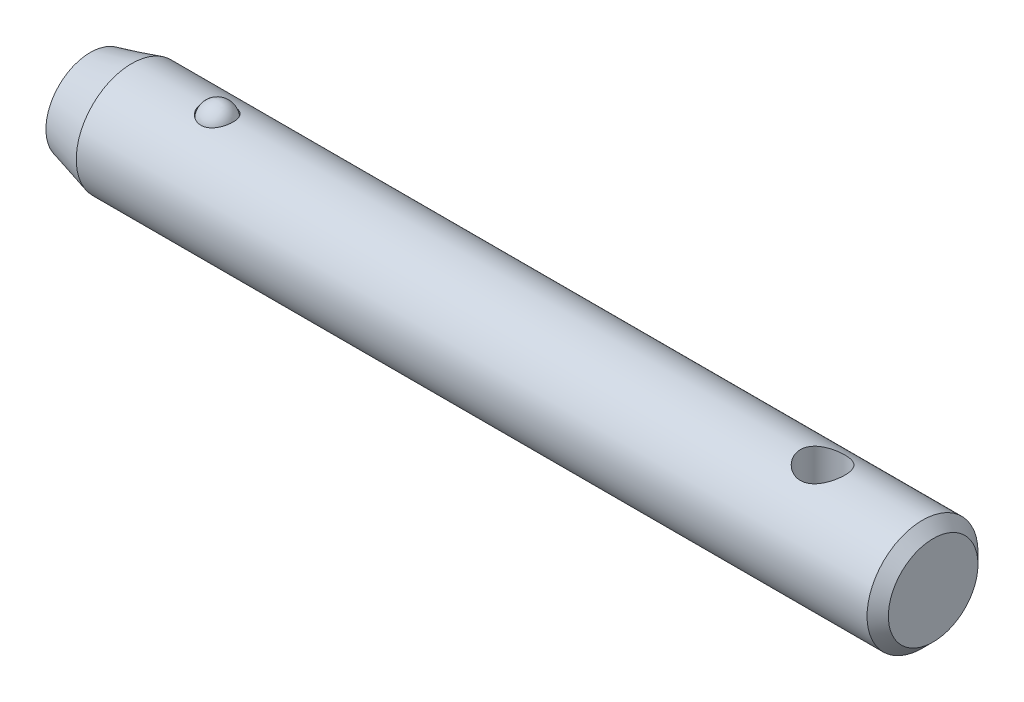
ISO-10303-21;
HEADER;
FILE_DESCRIPTION(('STEP AP214'),'2;1');
FILE_NAME('part.step','',(''),(''),'','','');
FILE_SCHEMA(('AUTOMOTIVE_DESIGN { 1 0 10303 214 1 1 1 1 }'));
ENDSEC;
DATA;
#1=APPLICATION_CONTEXT('core data for automotive mechanical design processes');
#2=APPLICATION_PROTOCOL_DEFINITION('international standard','automotive_design',2000,#1);
#3=PRODUCT_CONTEXT('',#1,'mechanical');
#4=PRODUCT('Part','Part','',(#3));
#5=PRODUCT_RELATED_PRODUCT_CATEGORY('part','',(#4));
#6=PRODUCT_DEFINITION_FORMATION('','',#4);
#7=PRODUCT_DEFINITION_CONTEXT('part definition',#1,'design');
#8=PRODUCT_DEFINITION('design','',#6,#7);
#9=PRODUCT_DEFINITION_SHAPE('','',#8);
#10=(LENGTH_UNIT() NAMED_UNIT(*) SI_UNIT(.MILLI.,.METRE.));
#11=(NAMED_UNIT(*) PLANE_ANGLE_UNIT() SI_UNIT($,.RADIAN.));
#12=(NAMED_UNIT(*) SI_UNIT($,.STERADIAN.) SOLID_ANGLE_UNIT());
#13=UNCERTAINTY_MEASURE_WITH_UNIT(LENGTH_MEASURE(1.E-05),#10,'distance_accuracy_value','');
#14=(GEOMETRIC_REPRESENTATION_CONTEXT(3) GLOBAL_UNCERTAINTY_ASSIGNED_CONTEXT((#13)) GLOBAL_UNIT_ASSIGNED_CONTEXT((#10,
#11,#12)) REPRESENTATION_CONTEXT('',''));
#15=CARTESIAN_POINT('',(0.,0.,0.));
#16=DIRECTION('',(0.,0.,1.));
#17=DIRECTION('',(1.,0.,0.));
#18=AXIS2_PLACEMENT_3D('',#15,#16,#17);
#19=CARTESIAN_POINT('',(-10.5325354166626,1.7859375,0.));
#20=DIRECTION('',(-1.,0.,0.));
#21=DIRECTION('',(0.,1.,0.));
#22=AXIS2_PLACEMENT_3D('',#19,#20,#21);
#23=SPHERICAL_SURFACE('',#22,0.5730875);
#24=CARTESIAN_POINT('',(-11.1056229166626,1.7859375,0.));
#25=VERTEX_POINT('',#24);
#26=VERTEX_LOOP('',#25);
#27=FACE_BOUND('',#26,.T.);
#28=ADVANCED_FACE('F43',(#27),#23,.T.);
#29=CLOSED_SHELL('',(#28));
#30=MANIFOLD_SOLID_BREP('B2',#29);
#31=CARTESIAN_POINT('',(39.8114454860181,0.,0.));
#32=DIRECTION('',(1.,0.,0.));
#33=DIRECTION('',(0.,0.,-1.));
#34=AXIS2_PLACEMENT_3D('',#31,#32,#33);
#35=CYLINDRICAL_SURFACE('',#34,1.984375);
#36=CARTESIAN_POINT('',(11.9126,1.984375,0.));
#37=CARTESIAN_POINT('',(11.9125960900575,1.98437210768249,-0.0426612865351476));
#38=CARTESIAN_POINT('',(11.9091401421399,1.98298313678064,-0.0853966113734861));
#39=CARTESIAN_POINT('',(11.895436067665,1.97756245449317,-0.169662665665853));
#40=CARTESIAN_POINT('',(11.8851694767377,1.97352355921117,-0.211189799219621));
#41=CARTESIAN_POINT('',(11.8582773065204,1.96323826781456,-0.291684838082439));
#42=CARTESIAN_POINT('',(11.8416725454077,1.95699910369491,-0.330660637579232));
#43=CARTESIAN_POINT('',(11.802658015586,1.94292779909693,-0.405237938224073));
#44=CARTESIAN_POINT('',(11.7802502619541,1.93509621178666,-0.440840604835552));
#45=CARTESIAN_POINT('',(11.7291502865086,1.91821945448885,-0.509389462379502));
#46=CARTESIAN_POINT('',(11.7002295458046,1.90913661593772,-0.542155964418368));
#47=CARTESIAN_POINT('',(11.6374068736202,1.89095291459646,-0.602525705023939));
#48=CARTESIAN_POINT('',(11.6035025195441,1.88185204517599,-0.630126417518624));
#49=CARTESIAN_POINT('',(11.5298426096226,1.86421232994488,-0.680590843894364));
#50=CARTESIAN_POINT('',(11.4898938008595,1.8557165227359,-0.703189070661956));
#51=CARTESIAN_POINT('',(11.406371491877,1.84083978727258,-0.741265154117871));
#52=CARTESIAN_POINT('',(11.3627997248852,1.83445785493782,-0.756746392700943));
#53=CARTESIAN_POINT('',(11.2753329176056,1.82493585696637,-0.779422345535237));
#54=CARTESIAN_POINT('',(11.2315421658807,1.82166188703631,-0.786961042679119));
#55=CARTESIAN_POINT('',(11.1432042350468,1.81833839107004,-0.794612394150889));
#56=CARTESIAN_POINT('',(11.0986574386957,1.81828727941849,-0.794728700224313));
#57=CARTESIAN_POINT('',(11.0133778210151,1.82130104798623,-0.787792655228369));
#58=CARTESIAN_POINT('',(10.9725953258439,1.82414931968385,-0.781238640364854));
#59=CARTESIAN_POINT('',(10.8927663637098,1.8322773695686,-0.7619789181182));
#60=CARTESIAN_POINT('',(10.8537202009687,1.83755757202664,-0.749272137313091));
#61=CARTESIAN_POINT('',(10.7775304212597,1.8500704564451,-0.717825721981209));
#62=CARTESIAN_POINT('',(10.7404418957502,1.85734078652063,-0.698968257856394));
#63=CARTESIAN_POINT('',(10.6698193478815,1.87300439942237,-0.6558385016031));
#64=CARTESIAN_POINT('',(10.6362866675183,1.88139810353187,-0.6315641757744));
#65=CARTESIAN_POINT('',(10.5709998888817,1.89915298644589,-0.576084144158481));
#66=CARTESIAN_POINT('',(10.5395836605011,1.9085387953741,-0.544487680616473));
#67=CARTESIAN_POINT('',(10.4823877227929,1.92666868030318,-0.47637478838636));
#68=CARTESIAN_POINT('',(10.4566091360278,1.93541262826738,-0.439857382179605));
#69=CARTESIAN_POINT('',(10.4109768255568,1.95149264126868,-0.361980818377945));
#70=CARTESIAN_POINT('',(10.3912502196499,1.95879747819118,-0.320540257503135));
#71=CARTESIAN_POINT('',(10.3591646301346,1.97094009992976,-0.23456255692602));
#72=CARTESIAN_POINT('',(10.3468019038444,1.97577913780383,-0.190027003124715));
#73=CARTESIAN_POINT('',(10.3304783327553,1.98221655366805,-0.101955555394354));
#74=CARTESIAN_POINT('',(10.3260634322181,1.98398981627676,-0.0585165573005095));
#75=CARTESIAN_POINT('',(10.3244201132277,1.98464677408907,0.0285136073299771));
#76=CARTESIAN_POINT('',(10.3271898320108,1.98353121827972,0.0721047314982445));
#77=CARTESIAN_POINT('',(10.3395032892941,1.97865034428427,0.156143618339039));
#78=CARTESIAN_POINT('',(10.3487370734518,1.97500633440255,0.196644613923392));
#79=CARTESIAN_POINT('',(10.3732947967355,1.96556090807808,0.275484998011623));
#80=CARTESIAN_POINT('',(10.388619518181,1.95975921450873,0.313824108120486));
#81=CARTESIAN_POINT('',(10.4254240229355,1.94634086049666,0.388571893121005));
#82=CARTESIAN_POINT('',(10.4470777342171,1.93867411341984,0.424885652781053));
#83=CARTESIAN_POINT('',(10.4957325660501,1.9223567913338,0.493491675275978));
#84=CARTESIAN_POINT('',(10.5227358295349,1.91370582265639,0.525782318052074));
#85=CARTESIAN_POINT('',(10.5834140363894,1.89565406062626,0.587661957702064));
#86=CARTESIAN_POINT('',(10.6174117492853,1.88624147065567,0.616931842479283));
#87=CARTESIAN_POINT('',(10.6900027829443,1.86825601438987,0.669429381473568));
#88=CARTESIAN_POINT('',(10.7285968595099,1.85968328662084,0.692656039968325));
#89=CARTESIAN_POINT('',(10.809867610042,1.84433487775872,0.732554852329117));
#90=CARTESIAN_POINT('',(10.8525802121874,1.837577410074,0.749161329705863));
#91=CARTESIAN_POINT('',(10.9405474180245,1.82690957911554,0.774817562195545));
#92=CARTESIAN_POINT('',(10.9858001191818,1.82299711479349,0.783872894591262));
#93=CARTESIAN_POINT('',(11.0740538860168,1.81876604472158,0.793637135607368));
#94=CARTESIAN_POINT('',(11.1169826394636,1.81820907712618,0.794899779538953));
#95=CARTESIAN_POINT('',(11.202409990405,1.82012763050636,0.79049687883827));
#96=CARTESIAN_POINT('',(11.2449086418301,1.82260276641402,0.784832213953285));
#97=CARTESIAN_POINT('',(11.3265474628487,1.83009638853236,0.767187698442232));
#98=CARTESIAN_POINT('',(11.3657539839156,1.83501042631519,0.755466442760985));
#99=CARTESIAN_POINT('',(11.4416596436279,1.84675462989226,0.726283412369874));
#100=CARTESIAN_POINT('',(11.4783580864259,1.85358532478634,0.708820052303173));
#101=CARTESIAN_POINT('',(11.5504950676481,1.86887885686782,0.667493252720271));
#102=CARTESIAN_POINT('',(11.585741159708,1.87741275168068,0.643320617391425));
#103=CARTESIAN_POINT('',(11.6518504727652,1.89493447360232,0.589713434835878));
#104=CARTESIAN_POINT('',(11.6827123676884,1.90392243694211,0.560277301630945));
#105=CARTESIAN_POINT('',(11.741230507389,1.92204009437809,0.494706872801886));
#106=CARTESIAN_POINT('',(11.7685491811752,1.93114119566242,0.458262037954876));
#107=CARTESIAN_POINT('',(11.8166900137905,1.94786411414506,0.380960439613421));
#108=CARTESIAN_POINT('',(11.8375091513855,1.95548524277497,0.340101636179687));
#109=CARTESIAN_POINT('',(11.8715719416537,1.96826074317545,0.255880418552786));
#110=CARTESIAN_POINT('',(11.884949450288,1.97345840962464,0.212578798480944));
#111=CARTESIAN_POINT('',(11.9041224011287,1.98097896526842,0.124172879305361));
#112=CARTESIAN_POINT('',(11.9099419045827,1.98331097612331,0.0790747743252574));
#113=CARTESIAN_POINT('',(11.9123600418258,1.98427935115704,0.0225870682254636));
#114=CARTESIAN_POINT('',(11.9126010352997,1.98437576584642,0.0112961295939889));
#115=CARTESIAN_POINT('',(11.9126,1.984375,0.));
#116=B_SPLINE_CURVE_WITH_KNOTS('',3,(#36,#37,#38,#39,#40,#41,#42,#43,#44,#45,#46,#47,#48,#49,
#50,#51,#52,#53,#54,#55,#56,#57,#58,#59,#60,#61,#62,#63,#64,#65,#66,#67,#68,#69,#70,#71,#72,#73,
#74,#75,#76,#77,#78,#79,#80,#81,#82,#83,#84,#85,#86,#87,#88,#89,#90,#91,#92,#93,#94,#95,#96,#97,
#98,#99,#100,#101,#102,#103,#104,#105,#106,#107,#108,#109,#110,#111,#112,#113,#114,#115),
.UNSPECIFIED.,.T.,.F.,(4,2,2,2,2,2,2,2,2,2,2,2,2,2,2,2,2,2,2,2,2,2,2,2,2,2,2,2,2,2,2,2,2,2,2,2,
2,2,2,4),(0.,0.127953685820063,0.25625569304065,0.384139859684036,0.511979678222939,
0.645308358623454,0.778702067395949,0.918032433438772,1.05729652300063,1.19024441794441,
1.32312690328882,1.44676149084295,1.57041765567244,1.69659746999843,1.82282473706717,
1.95880969833415,2.0948217122077,2.23352087411489,2.37214948207661,2.50257145109554,
2.63295960885627,2.75748930802108,2.88203500694414,3.01039019379936,3.13879690176154,
3.27568113366565,3.41258790526738,3.55082096040267,3.68895182581356,3.81714245377748,
3.9453168036096,4.06842245174044,4.19156211710175,4.32175232635001,4.45198183035145,
4.59065480589993,4.72939214632338,4.86554581964662,5.00126497047975,5.03514536965292),.UNSPECIFIED.);
#117=CARTESIAN_POINT('',(11.9126,1.984375,0.));
#118=VERTEX_POINT('',#117);
#119=EDGE_CURVE('E45',#118,#118,#116,.T.);
#120=ORIENTED_EDGE('',*,*,#119,.F.);
#121=EDGE_LOOP('',(#120));
#122=FACE_BOUND('',#121,.T.);
#123=CARTESIAN_POINT('',(11.11885,-1.8187097289356,-0.793750000000003));
#124=CARTESIAN_POINT('',(11.1613709883084,-1.81871402376142,-0.793745338387131));
#125=CARTESIAN_POINT('',(11.2039521184609,-1.82022195360943,-0.790312990504637));
#126=CARTESIAN_POINT('',(11.2878928867981,-1.82606519068301,-0.776711771516493));
#127=CARTESIAN_POINT('',(11.3292491208413,-1.83040772231657,-0.766525686450473));
#128=CARTESIAN_POINT('',(11.4093835113444,-1.84134305892171,-0.739868278550707));
#129=CARTESIAN_POINT('',(11.4481707422336,-1.8479273761673,-0.723420635533531));
#130=CARTESIAN_POINT('',(11.5224262545599,-1.86259257709689,-0.684776169406861));
#131=CARTESIAN_POINT('',(11.5578952583818,-1.87067313389994,-0.662580601615541));
#132=CARTESIAN_POINT('',(11.6265564721396,-1.88793780817129,-0.611712158664385));
#133=CARTESIAN_POINT('',(11.6595352053501,-1.89715742439877,-0.582763057598036));
#134=CARTESIAN_POINT('',(11.7203255708095,-1.91536818863465,-0.519790801354076));
#135=CARTESIAN_POINT('',(11.7481353973869,-1.92435925585998,-0.485765880477538));
#136=CARTESIAN_POINT('',(11.7988581638025,-1.94152602513033,-0.411958754422689));
#137=CARTESIAN_POINT('',(11.8215347696462,-1.94965559586916,-0.372002433227376));
#138=CARTESIAN_POINT('',(11.8597535412047,-1.9637530877877,-0.288458800016064));
#139=CARTESIAN_POINT('',(11.8752986100447,-1.96972188837042,-0.244872974061161));
#140=CARTESIAN_POINT('',(11.8980511524298,-1.97857397737663,-0.157546050651686));
#141=CARTESIAN_POINT('',(11.9056258402791,-1.9815926553272,-0.113914628344329));
#142=CARTESIAN_POINT('',(11.9134050552474,-1.98469373302198,-0.0259025741780686));
#143=CARTESIAN_POINT('',(11.9136123312616,-1.98477722792821,0.0184777720619562));
#144=CARTESIAN_POINT('',(11.9068521507456,-1.98208091494896,0.104073521340139));
#145=CARTESIAN_POINT('',(11.9002870433161,-1.97946167468822,0.145326676609382));
#146=CARTESIAN_POINT('',(11.8808528272142,-1.97187062551676,0.226089015221028));
#147=CARTESIAN_POINT('',(11.8679832559848,-1.96689864398691,0.265598070367345));
#148=CARTESIAN_POINT('',(11.8361473958585,-1.9549936470665,0.342462619346814));
#149=CARTESIAN_POINT('',(11.8170921444326,-1.94803220560261,0.379776681778793));
#150=CARTESIAN_POINT('',(11.773509200379,-1.93283913493192,0.450773859825167));
#151=CARTESIAN_POINT('',(11.7489796321144,-1.92460707067701,0.484455725077957));
#152=CARTESIAN_POINT('',(11.6932673741712,-1.90707024755151,0.549580128609386));
#153=CARTESIAN_POINT('',(11.6617536113808,-1.8977305458772,0.580730457342977));
#154=CARTESIAN_POINT('',(11.5939131168086,-1.87944784195397,0.637423880481052));
#155=CARTESIAN_POINT('',(11.5575848158888,-1.87050497031238,0.662965139554616));
#156=CARTESIAN_POINT('',(11.4798399504815,-1.85379081172219,0.708383849907354));
#157=CARTESIAN_POINT('',(11.4383086454017,-1.84605975315735,0.728080939907293));
#158=CARTESIAN_POINT('',(11.3521269772229,-1.83311637466719,0.760085578174115));
#159=CARTESIAN_POINT('',(11.3074786610441,-1.82790241925825,0.772397925929249));
#160=CARTESIAN_POINT('',(11.2192451758301,-1.82098060870049,0.788572745317686));
#161=CARTESIAN_POINT('',(11.1757616975492,-1.8190780168408,0.79290548842084));
#162=CARTESIAN_POINT('',(11.0886568581671,-1.81843956969973,0.794369651434457));
#163=CARTESIAN_POINT('',(11.0450355428866,-1.81970275410727,0.791503255141553));
#164=CARTESIAN_POINT('',(10.9615053601898,-1.82505367604237,0.779078680119198));
#165=CARTESIAN_POINT('',(10.9215265529696,-1.8289764418849,0.769910933990562));
#166=CARTESIAN_POINT('',(10.8437011643506,-1.83899989001686,0.745650411680416));
#167=CARTESIAN_POINT('',(10.8058550578605,-1.8451010551897,0.730556321738765));
#168=CARTESIAN_POINT('',(10.7316578142499,-1.85909657175668,0.694188206919205));
#169=CARTESIAN_POINT('',(10.6954295438619,-1.86705360903657,0.672688388342513));
#170=CARTESIAN_POINT('',(10.6269301893591,-1.88376871609517,0.624349948450371));
#171=CARTESIAN_POINT('',(10.5946607254842,-1.89252711130625,0.597509152913164));
#172=CARTESIAN_POINT('',(10.5325174284622,-1.91063926026148,0.536910046510694));
#173=CARTESIAN_POINT('',(10.5029966131501,-1.91998920391315,0.502787217311025));
#174=CARTESIAN_POINT('',(10.4500453477203,-1.93762230969001,0.429848816993262));
#175=CARTESIAN_POINT('',(10.4266151455067,-1.94590542838567,0.391033054954435));
#176=CARTESIAN_POINT('',(10.3865967232482,-1.96049787247926,0.30967359880695));
#177=CARTESIAN_POINT('',(10.3700068649717,-1.96680767039109,0.267130800269521));
#178=CARTESIAN_POINT('',(10.3443290492007,-1.97672608158125,0.179543706396068));
#179=CARTESIAN_POINT('',(10.335237020366,-1.98033616071431,0.134500782835539));
#180=CARTESIAN_POINT('',(10.3252965715424,-1.98429168883547,0.0463615525436894));
#181=CARTESIAN_POINT('',(10.3239490115164,-1.98483476676871,0.00332997674786914));
#182=CARTESIAN_POINT('',(10.3282176433409,-1.98312898069004,-0.0823253035566308));
#183=CARTESIAN_POINT('',(10.3338327810587,-1.98088053930618,-0.124949068822241));
#184=CARTESIAN_POINT('',(10.3515107566298,-1.97394319366439,-0.207236576709982));
#185=CARTESIAN_POINT('',(10.3633702379737,-1.9693313762675,-0.246951025594828));
#186=CARTESIAN_POINT('',(10.3929865818105,-1.9581611992084,-0.323819184544955));
#187=CARTESIAN_POINT('',(10.4107445320143,-1.9516024805503,-0.360972420781076));
#188=CARTESIAN_POINT('',(10.4525378319005,-1.93682181199148,-0.433468082236646));
#189=CARTESIAN_POINT('',(10.4768159045325,-1.92853917110891,-0.4686579347638));
#190=CARTESIAN_POINT('',(10.5305973185491,-1.91130794389621,-0.534612067570492));
#191=CARTESIAN_POINT('',(10.5601028226576,-1.90235908282542,-0.565374506530348));
#192=CARTESIAN_POINT('',(10.6256594797334,-1.88411549912646,-0.623570502081004));
#193=CARTESIAN_POINT('',(10.6620027716311,-1.87483366065262,-0.650680089607116));
#194=CARTESIAN_POINT('',(10.739017660792,-1.85757213366712,-0.698439456893138));
#195=CARTESIAN_POINT('',(10.7796897661861,-1.84959259830334,-0.71908847716656));
#196=CARTESIAN_POINT('',(10.8604991394835,-1.83657424331732,-0.751677712920347));
#197=CARTESIAN_POINT('',(10.9003565150419,-1.83133570823998,-0.764233419683922));
#198=CARTESIAN_POINT('',(10.9817239009158,-1.82342632680323,-0.782922360134174));
#199=CARTESIAN_POINT('',(11.0232289678994,-1.82074832728644,-0.789073490068058));
#200=CARTESIAN_POINT('',(11.0828842200529,-1.81897519569436,-0.793140502516853));
#201=CARTESIAN_POINT('',(11.1008617283334,-1.81870791203301,-0.793751972069846));
#202=CARTESIAN_POINT('',(11.11885,-1.8187097289356,-0.793750000000003));
#203=B_SPLINE_CURVE_WITH_KNOTS('',3,(#123,#124,#125,#126,#127,#128,#129,#130,#131,#132,#133,
#134,#135,#136,#137,#138,#139,#140,#141,#142,#143,#144,#145,#146,#147,#148,#149,#150,#151,#152,
#153,#154,#155,#156,#157,#158,#159,#160,#161,#162,#163,#164,#165,#166,#167,#168,#169,#170,#171,
#172,#173,#174,#175,#176,#177,#178,#179,#180,#181,#182,#183,#184,#185,#186,#187,#188,#189,#190,
#191,#192,#193,#194,#195,#196,#197,#198,#199,#200,#201,#202),.UNSPECIFIED.,.T.,.F.,(4,2,2,2,2,2,
2,2,2,2,2,2,2,2,2,2,2,2,2,2,2,2,2,2,2,2,2,2,2,2,2,2,2,2,2,2,2,2,2,4),(0.,0.127507066854663,
0.255340380154454,0.382694982994566,0.510021795644701,0.643951985066312,0.777928873194986,
0.917188717956609,1.05639182203513,1.18885566333351,1.32127007980689,1.44624680917027,
1.57123270941846,1.69810231655726,1.82501545929325,1.96026104994789,2.09555082828579,
2.23466207052348,2.37368280340164,2.50421039796378,2.63469840289212,2.75775439081415,
2.88083767337492,3.00891239500414,3.1370393607507,3.27463044526894,3.41222712923558,
3.54979084024896,3.68727980454422,3.81579850150768,3.94429774347938,4.06884979042329,
4.19342481823344,4.32350485918782,4.45363884384043,4.59182888020352,4.73003515570802,
4.85583174760195,4.98127587615887,5.03521704378543),.UNSPECIFIED.);
#204=CARTESIAN_POINT('',(11.11885,-1.8187097289356,-0.793750000000003));
#205=VERTEX_POINT('',#204);
#206=EDGE_CURVE('E62',#205,#205,#203,.T.);
#207=ORIENTED_EDGE('',*,*,#206,.F.);
#208=EDGE_LOOP('',(#207));
#209=FACE_BOUND('',#208,.T.);
#210=CARTESIAN_POINT('',(14.6939,0.,0.));
#211=DIRECTION('',(1.,0.,0.));
#212=DIRECTION('',(0.,0.,-1.));
#213=AXIS2_PLACEMENT_3D('',#210,#211,#212);
#214=CIRCLE('',#213,1.984375);
#215=CARTESIAN_POINT('',(14.6939,0.,-1.984375));
#216=VERTEX_POINT('',#215);
#217=EDGE_CURVE('E118',#216,#216,#214,.T.);
#218=ORIENTED_EDGE('',*,*,#217,.F.);
#219=EDGE_LOOP('',(#218));
#220=FACE_BOUND('',#219,.T.);
#221=CARTESIAN_POINT('',(-13.5937423357461,0.,0.));
#222=DIRECTION('',(1.,0.,0.));
#223=DIRECTION('',(0.,0.,-1.));
#224=AXIS2_PLACEMENT_3D('',#221,#222,#223);
#225=CIRCLE('',#224,1.984375);
#226=CARTESIAN_POINT('',(-13.5937423357461,0.,-1.984375));
#227=VERTEX_POINT('',#226);
#228=EDGE_CURVE('E69',#227,#227,#225,.T.);
#229=ORIENTED_EDGE('',*,*,#228,.T.);
#230=EDGE_LOOP('',(#229));
#231=FACE_BOUND('',#230,.T.);
#232=CARTESIAN_POINT('',(-10.5325354166626,1.8951194,0.588444220275184));
#233=CARTESIAN_POINT('',(-10.5629546226428,1.89511966951429,0.588443919644855));
#234=CARTESIAN_POINT('',(-10.593377414144,1.89590452620942,0.585933450579152));
#235=CARTESIAN_POINT('',(-10.6533311077073,1.89895261139773,0.575976987985483));
#236=CARTESIAN_POINT('',(-10.6828617619571,1.90121624677769,0.568529636063152));
#237=CARTESIAN_POINT('',(-10.7401515588187,1.90695750688567,0.548962747515325));
#238=CARTESIAN_POINT('',(-10.7679132728371,1.91043331961825,0.536850181771699));
#239=CARTESIAN_POINT('',(-10.821001376245,1.91821840684766,0.508330434458828));
#240=CARTESIAN_POINT('',(-10.8463275681322,1.92252774885215,0.491922905001787));
#241=CARTESIAN_POINT('',(-10.894550843812,1.93164322822779,0.454830920602075));
#242=CARTESIAN_POINT('',(-10.9173723669971,1.93645901586786,0.434050731737875));
#243=CARTESIAN_POINT('',(-10.9593533731564,1.94599797314362,0.389055756583387));
#244=CARTESIAN_POINT('',(-10.9785121599335,1.95072112501871,0.364840318856511));
#245=CARTESIAN_POINT('',(-11.0135792697045,1.9598139451965,0.31242871278134));
#246=CARTESIAN_POINT('',(-11.0292974712369,1.96415734961258,0.284100649667973));
#247=CARTESIAN_POINT('',(-11.0559978062927,1.97178334589193,0.225160976637039));
#248=CARTESIAN_POINT('',(-11.0669792145804,1.97506577529333,0.194549017880288));
#249=CARTESIAN_POINT('',(-11.0842121429827,1.9803044629238,0.131063386201646));
#250=CARTESIAN_POINT('',(-11.090335642082,1.9822246936618,0.0981519095607598));
#251=CARTESIAN_POINT('',(-11.0972571017307,1.98439981947509,0.03171931241531));
#252=CARTESIAN_POINT('',(-11.0980548045418,1.98465463395364,-0.00180183751527134));
#253=CARTESIAN_POINT('',(-11.0942971340868,1.98346870712274,-0.0687230120331597));
#254=CARTESIAN_POINT('',(-11.089708410726,1.98201740228105,-0.102120984022691));
#255=CARTESIAN_POINT('',(-11.0752132718773,1.97755429564468,-0.167635446017659));
#256=CARTESIAN_POINT('',(-11.0653066938722,1.9745424461588,-0.199751896826719));
#257=CARTESIAN_POINT('',(-11.0403827002582,1.9672815840515,-0.261767200218443));
#258=CARTESIAN_POINT('',(-11.0253681419959,1.96303326328972,-0.291667281249549));
#259=CARTESIAN_POINT('',(-10.9905404457282,1.9537626579786,-0.348400116653651));
#260=CARTESIAN_POINT('',(-10.9707273143771,1.94874037450252,-0.37523287527999));
#261=CARTESIAN_POINT('',(-10.9269840548198,1.93854691978572,-0.424750937742226));
#262=CARTESIAN_POINT('',(-10.9031002838557,1.93337791873276,-0.447477576350332));
#263=CARTESIAN_POINT('',(-10.8516541464158,1.92344544317163,-0.488412437581079));
#264=CARTESIAN_POINT('',(-10.8240925195761,1.91868188744094,-0.506621566598771));
#265=CARTESIAN_POINT('',(-10.7670642350579,1.91029921098619,-0.537351871871764));
#266=CARTESIAN_POINT('',(-10.7376979714738,1.90664587990717,-0.550049768514627));
#267=CARTESIAN_POINT('',(-10.6770911553599,1.90071318383507,-0.570215166971866));
#268=CARTESIAN_POINT('',(-10.6458512555859,1.89843334335413,-0.577684479011883));
#269=CARTESIAN_POINT('',(-10.5840134155361,1.89560664021834,-0.586891505919954));
#270=CARTESIAN_POINT('',(-10.5534575788192,1.89498124650665,-0.588889118184557));
#271=CARTESIAN_POINT('',(-10.4924445407427,1.8953089886069,-0.587833661534704));
#272=CARTESIAN_POINT('',(-10.4619873248553,1.89626188023331,-0.584781373919143));
#273=CARTESIAN_POINT('',(-10.402748808766,1.89959491998199,-0.573859110250949));
#274=CARTESIAN_POINT('',(-10.3739452094123,1.90194242405497,-0.566099240460577));
#275=CARTESIAN_POINT('',(-10.31806098501,1.90777875215041,-0.546106281752317));
#276=CARTESIAN_POINT('',(-10.2909804998618,1.91126766870384,-0.53387283016471));
#277=CARTESIAN_POINT('',(-10.2386173662861,1.91910844123269,-0.504970511316649));
#278=CARTESIAN_POINT('',(-10.2133898485193,1.92347817304135,-0.488206796170669));
#279=CARTESIAN_POINT('',(-10.166012868558,1.93257210770537,-0.45086337964902));
#280=CARTESIAN_POINT('',(-10.1438640584022,1.93729638532463,-0.430282872063703));
#281=CARTESIAN_POINT('',(-10.1021466616732,1.94685086245056,-0.384810828899873));
#282=CARTESIAN_POINT('',(-10.0827478248821,1.95167563678229,-0.359762365717433));
#283=CARTESIAN_POINT('',(-10.0482264093598,1.96070299960077,-0.306773430872048));
#284=CARTESIAN_POINT('',(-10.0331046514303,1.96490546858911,-0.278832405509478));
#285=CARTESIAN_POINT('',(-10.0069572075834,1.97240498336039,-0.219729557429932));
#286=CARTESIAN_POINT('',(-9.99610216354292,1.97566315181225,-0.188487176471557));
#287=CARTESIAN_POINT('',(-9.97951709083534,1.98072154381689,-0.124557073959407));
#288=CARTESIAN_POINT('',(-9.97378750840827,1.98252164042372,-0.0918692268184045));
#289=CARTESIAN_POINT('',(-9.96752217765698,1.98449253738043,-0.0254988422537769));
#290=CARTESIAN_POINT('',(-9.96705834116495,1.98464077861084,0.00819118122191325));
#291=CARTESIAN_POINT('',(-9.97152082312861,1.98323350401424,0.0751769170114349));
#292=CARTESIAN_POINT('',(-9.97644731339958,1.98167793387867,0.108472616722103));
#293=CARTESIAN_POINT('',(-9.99160577554521,1.97702251897229,0.173781331360626));
#294=CARTESIAN_POINT('',(-10.0018466256678,1.9739200903379,0.205792102955817));
#295=CARTESIAN_POINT('',(-10.0274325324292,1.96650095203836,0.267556153044771));
#296=CARTESIAN_POINT('',(-10.0427776884769,1.96218421872427,0.297309387557982));
#297=CARTESIAN_POINT('',(-10.0781736026032,1.95282962190698,0.353569400273047));
#298=CARTESIAN_POINT('',(-10.0982042020855,1.94779488278472,0.380089365811304));
#299=CARTESIAN_POINT('',(-10.1425587427,1.93755971706596,0.429228986951859));
#300=CARTESIAN_POINT('',(-10.166882562266,1.93235929516431,0.451848752955697));
#301=CARTESIAN_POINT('',(-10.2186272281071,1.92252381863742,0.492001287552319));
#302=CARTESIAN_POINT('',(-10.2459662229529,1.91787868748084,0.509636920924036));
#303=CARTESIAN_POINT('',(-10.3034255346563,1.90958494650444,0.539886159569951));
#304=CARTESIAN_POINT('',(-10.3335440728282,1.90593570523108,0.552502949423578));
#305=CARTESIAN_POINT('',(-10.3916286744522,1.90047315307393,0.570987136134335));
#306=CARTESIAN_POINT('',(-10.4193690860096,1.89848339810951,0.577516561903734));
#307=CARTESIAN_POINT('',(-10.4755838428539,1.89580650960702,0.586244865071803));
#308=CARTESIAN_POINT('',(-10.5040580585783,1.89511914769049,0.588444501714402));
#309=CARTESIAN_POINT('',(-10.5325354166626,1.8951194,0.588444220275184));
#310=B_SPLINE_CURVE_WITH_KNOTS('',3,(#232,#233,#234,#235,#236,#237,#238,#239,#240,#241,#242,
#243,#244,#245,#246,#247,#248,#249,#250,#251,#252,#253,#254,#255,#256,#257,#258,#259,#260,#261,
#262,#263,#264,#265,#266,#267,#268,#269,#270,#271,#272,#273,#274,#275,#276,#277,#278,#279,#280,
#281,#282,#283,#284,#285,#286,#287,#288,#289,#290,#291,#292,#293,#294,#295,#296,#297,#298,#299,
#300,#301,#302,#303,#304,#305,#306,#307,#308,#309),.UNSPECIFIED.,.T.,.F.,(4,2,2,2,2,2,2,2,2,2,2,
2,2,2,2,2,2,2,2,2,2,2,2,2,2,2,2,2,2,2,2,2,2,2,2,2,2,2,4),(0.,0.0911521769236612,
0.182329444988802,0.273370998907868,0.364419929385432,0.457720498721949,0.551038784636166,
0.648650831057441,0.746277817256021,0.846399240883164,0.946525509784927,1.04727499534964,
1.14802756006174,1.24872385734495,1.34942001499462,1.44903790397397,1.54863578938356,
1.64474891720885,1.74082875254131,1.83225860381903,1.92367431078429,2.01303015625586,
2.10239324734128,2.19379565715855,2.28521739566842,2.38092717784056,2.47665531495287,
2.57589573117203,2.67514478675701,2.77574763560646,2.8763536912391,2.97712836450756,
3.07790500052933,3.17825578216954,3.27860372274988,3.3766973212024,3.47472857719204,
3.56007690885402,3.64541027304867),.UNSPECIFIED.);
#311=CARTESIAN_POINT('',(-10.5325354166626,1.8951194,0.588444220275184));
#312=VERTEX_POINT('',#311);
#313=EDGE_CURVE('E79',#312,#312,#310,.T.);
#314=ORIENTED_EDGE('',*,*,#313,.T.);
#315=EDGE_LOOP('',(#314));
#316=FACE_BOUND('',#315,.T.);
#317=ADVANCED_FACE('F53',(#122,#209,#220,#231,#316),#35,.T.);
#318=CARTESIAN_POINT('',(-13.5937423357461,0.,0.));
#319=DIRECTION('',(1.,0.,0.));
#320=DIRECTION('',(0.,0.,-1.));
#321=AXIS2_PLACEMENT_3D('',#318,#319,#320);
#322=CONICAL_SURFACE('',#321,1.984375,0.261799387799151);
#323=CARTESIAN_POINT('',(-15.0749,0.,0.));
#324=DIRECTION('',(1.,0.,0.));
#325=DIRECTION('',(0.,0.,-1.));
#326=AXIS2_PLACEMENT_3D('',#323,#324,#325);
#327=CIRCLE('',#326,1.5875);
#328=CARTESIAN_POINT('',(-15.0749,0.,-1.5875));
#329=VERTEX_POINT('',#328);
#330=EDGE_CURVE('E73',#329,#329,#327,.T.);
#331=ORIENTED_EDGE('',*,*,#330,.T.);
#332=EDGE_LOOP('',(#331));
#333=FACE_BOUND('',#332,.T.);
#334=ORIENTED_EDGE('',*,*,#228,.F.);
#335=EDGE_LOOP('',(#334));
#336=FACE_BOUND('',#335,.T.);
#337=ADVANCED_FACE('F101',(#333,#336),#322,.T.);
#338=CARTESIAN_POINT('',(-15.0749,1.5875,0.));
#339=DIRECTION('',(-1.,0.,0.));
#340=DIRECTION('',(0.,0.,1.));
#341=AXIS2_PLACEMENT_3D('',#338,#339,#340);
#342=PLANE('',#341);
#343=ORIENTED_EDGE('',*,*,#330,.F.);
#344=EDGE_LOOP('',(#343));
#345=FACE_BOUND('',#344,.T.);
#346=ADVANCED_FACE('F99',(#345),#342,.T.);
#347=CARTESIAN_POINT('',(15.0749,1.60337500000003,0.));
#348=DIRECTION('',(1.,0.,0.));
#349=DIRECTION('',(0.,0.,-1.));
#350=AXIS2_PLACEMENT_3D('',#347,#348,#349);
#351=PLANE('',#350);
#352=CARTESIAN_POINT('',(15.0749,0.,0.));
#353=DIRECTION('',(1.,0.,0.));
#354=DIRECTION('',(0.,0.,-1.));
#355=AXIS2_PLACEMENT_3D('',#352,#353,#354);
#356=CIRCLE('',#355,1.60337500000003);
#357=CARTESIAN_POINT('',(15.0749,0.,-1.60337500000003));
#358=VERTEX_POINT('',#357);
#359=EDGE_CURVE('E122',#358,#358,#356,.T.);
#360=ORIENTED_EDGE('',*,*,#359,.T.);
#361=EDGE_LOOP('',(#360));
#362=FACE_BOUND('',#361,.T.);
#363=ADVANCED_FACE('F98',(#362),#351,.T.);
#364=CARTESIAN_POINT('',(15.0749,0.,0.));
#365=DIRECTION('',(-1.,0.,0.));
#366=DIRECTION('',(0.,0.,1.));
#367=AXIS2_PLACEMENT_3D('',#364,#365,#366);
#368=CONICAL_SURFACE('',#367,1.60337500000003,0.785398163397449);
#369=ORIENTED_EDGE('',*,*,#217,.T.);
#370=EDGE_LOOP('',(#369));
#371=FACE_BOUND('',#370,.T.);
#372=ORIENTED_EDGE('',*,*,#359,.F.);
#373=EDGE_LOOP('',(#372));
#374=FACE_BOUND('',#373,.T.);
#375=ADVANCED_FACE('F95',(#371,#374),#368,.T.);
#376=CARTESIAN_POINT('',(-10.5325354166626,1.7859375,0.));
#377=DIRECTION('',(-1.,0.,0.));
#378=DIRECTION('',(0.,1.,0.));
#379=AXIS2_PLACEMENT_3D('',#376,#377,#378);
#380=SPHERICAL_SURFACE('',#379,0.5984875);
#381=ORIENTED_EDGE('',*,*,#313,.F.);
#382=EDGE_LOOP('',(#381));
#383=FACE_BOUND('',#382,.T.);
#384=ADVANCED_FACE('F90',(#383),#380,.F.);
#385=CARTESIAN_POINT('',(11.11885,-1.984375,0.));
#386=DIRECTION('',(0.,-1.,0.));
#387=DIRECTION('',(0.,0.,-1.));
#388=AXIS2_PLACEMENT_3D('',#385,#386,#387);
#389=CYLINDRICAL_SURFACE('',#388,0.793750000000003);
#390=ORIENTED_EDGE('',*,*,#119,.T.);
#391=EDGE_LOOP('',(#390));
#392=FACE_BOUND('',#391,.T.);
#393=ORIENTED_EDGE('',*,*,#206,.T.);
#394=EDGE_LOOP('',(#393));
#395=FACE_BOUND('',#394,.T.);
#396=ADVANCED_FACE('F83',(#392,#395),#389,.F.);
#397=CLOSED_SHELL('',(#317,#337,#346,#363,#375,#384,#396));
#398=MANIFOLD_SOLID_BREP('B6',#397);
#399=ADVANCED_BREP_SHAPE_REPRESENTATION('',(#18,#30,#398),#14);
#400=SHAPE_DEFINITION_REPRESENTATION(#9,#399);
ENDSEC;
END-ISO-10303-21;
